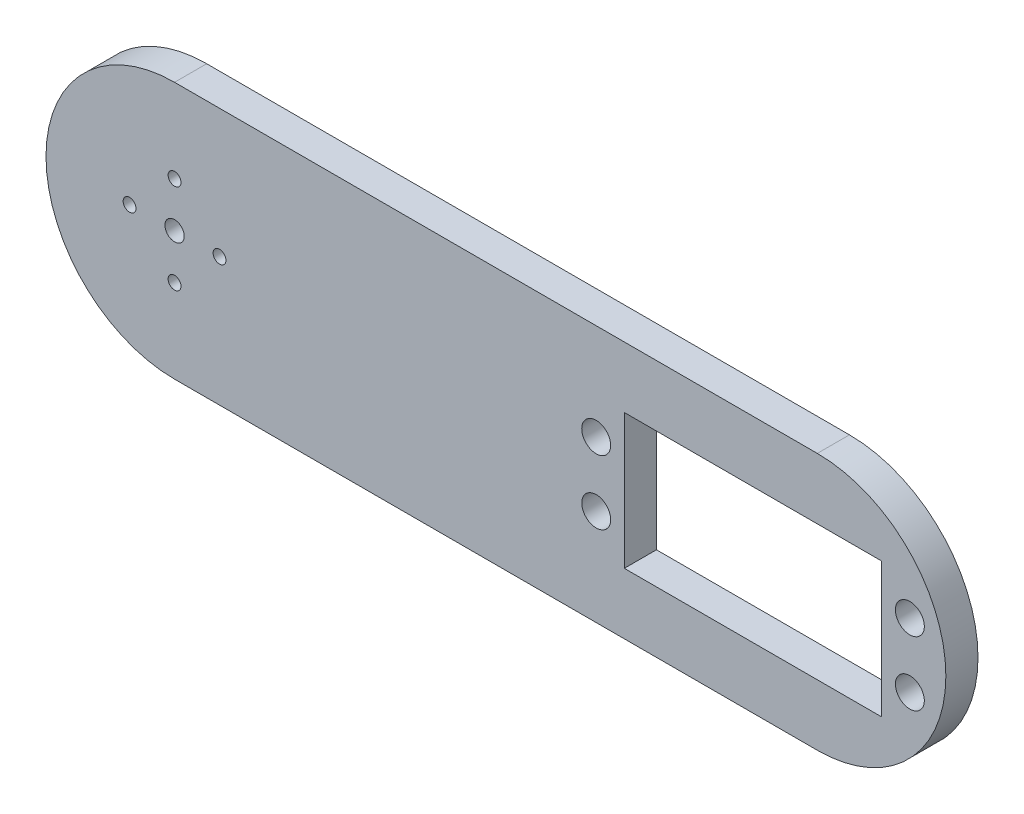
ISO-10303-21;
HEADER;
FILE_DESCRIPTION(('STEP AP214'),'2;1');
FILE_NAME('part.step','',(''),(''),'','','');
FILE_SCHEMA(('AUTOMOTIVE_DESIGN { 1 0 10303 214 1 1 1 1 }'));
ENDSEC;
DATA;
#1=APPLICATION_CONTEXT('core data for automotive mechanical design processes');
#2=APPLICATION_PROTOCOL_DEFINITION('international standard','automotive_design',2000,#1);
#3=PRODUCT_CONTEXT('',#1,'mechanical');
#4=PRODUCT('Part','Part','',(#3));
#5=PRODUCT_RELATED_PRODUCT_CATEGORY('part','',(#4));
#6=PRODUCT_DEFINITION_FORMATION('','',#4);
#7=PRODUCT_DEFINITION_CONTEXT('part definition',#1,'design');
#8=PRODUCT_DEFINITION('design','',#6,#7);
#9=PRODUCT_DEFINITION_SHAPE('','',#8);
#10=(LENGTH_UNIT() NAMED_UNIT(*) SI_UNIT(.MILLI.,.METRE.));
#11=(NAMED_UNIT(*) PLANE_ANGLE_UNIT() SI_UNIT($,.RADIAN.));
#12=(NAMED_UNIT(*) SI_UNIT($,.STERADIAN.) SOLID_ANGLE_UNIT());
#13=UNCERTAINTY_MEASURE_WITH_UNIT(LENGTH_MEASURE(1.E-05),#10,'distance_accuracy_value','');
#14=(GEOMETRIC_REPRESENTATION_CONTEXT(3) GLOBAL_UNCERTAINTY_ASSIGNED_CONTEXT((#13)) GLOBAL_UNIT_ASSIGNED_CONTEXT((#10,
#11,#12)) REPRESENTATION_CONTEXT('',''));
#15=CARTESIAN_POINT('',(0.,0.,0.));
#16=DIRECTION('',(0.,0.,1.));
#17=DIRECTION('',(1.,0.,0.));
#18=AXIS2_PLACEMENT_3D('',#15,#16,#17);
#19=CARTESIAN_POINT('',(0.,0.,0.));
#20=DIRECTION('',(0.,0.,-1.));
#21=DIRECTION('',(0.,1.,0.));
#22=AXIS2_PLACEMENT_3D('',#19,#20,#21);
#23=CYLINDRICAL_SURFACE('',#22,20.);
#24=CARTESIAN_POINT('',(0.,0.,-5.));
#25=DIRECTION('',(0.,0.,1.));
#26=DIRECTION('',(0.,-1.,0.));
#27=AXIS2_PLACEMENT_3D('',#24,#25,#26);
#28=CIRCLE('',#27,20.);
#29=CARTESIAN_POINT('',(0.,20.,-4.99999999999993));
#30=VERTEX_POINT('',#29);
#31=CARTESIAN_POINT('',(0.,-20.,-5.00000000000007));
#32=VERTEX_POINT('',#31);
#33=EDGE_CURVE('E166',#30,#32,#28,.T.);
#34=ORIENTED_EDGE('',*,*,#33,.T.);
#35=DIRECTION('',(0.,0.,-1.));
#36=VECTOR('',#35,1.);
#37=CARTESIAN_POINT('',(0.,-20.,0.));
#38=LINE('',#37,#36);
#39=CARTESIAN_POINT('',(0.,-20.,0.));
#40=VERTEX_POINT('',#39);
#41=EDGE_CURVE('E11',#40,#32,#38,.T.);
#42=ORIENTED_EDGE('',*,*,#41,.F.);
#43=CARTESIAN_POINT('',(0.,0.,0.));
#44=DIRECTION('',(0.,0.,1.));
#45=DIRECTION('',(0.,-1.,0.));
#46=AXIS2_PLACEMENT_3D('',#43,#44,#45);
#47=CIRCLE('',#46,20.);
#48=CARTESIAN_POINT('',(0.,20.,0.));
#49=VERTEX_POINT('',#48);
#50=EDGE_CURVE('E189',#49,#40,#47,.T.);
#51=ORIENTED_EDGE('',*,*,#50,.F.);
#52=DIRECTION('',(0.,0.,-1.));
#53=VECTOR('',#52,1.);
#54=CARTESIAN_POINT('',(0.,20.,0.));
#55=LINE('',#54,#53);
#56=EDGE_CURVE('E200',#49,#30,#55,.T.);
#57=ORIENTED_EDGE('',*,*,#56,.T.);
#58=EDGE_LOOP('',(#34,#42,#51,#57));
#59=FACE_BOUND('',#58,.T.);
#60=ADVANCED_FACE('F37',(#59),#23,.T.);
#61=CARTESIAN_POINT('',(100.,-20.0000000000001,0.));
#62=DIRECTION('',(0.,-1.,0.));
#63=DIRECTION('',(1.,0.,0.));
#64=AXIS2_PLACEMENT_3D('',#61,#62,#63);
#65=PLANE('',#64);
#66=DIRECTION('',(-1.,0.,0.));
#67=VECTOR('',#66,1.);
#68=CARTESIAN_POINT('',(100.,-20.0000000000001,-5.00000000000007));
#69=LINE('',#68,#67);
#70=CARTESIAN_POINT('',(100.,-20.,-5.00000000000007));
#71=VERTEX_POINT('',#70);
#72=EDGE_CURVE('E203',#71,#32,#69,.T.);
#73=ORIENTED_EDGE('',*,*,#72,.F.);
#74=DIRECTION('',(0.,0.,-1.));
#75=VECTOR('',#74,1.);
#76=CARTESIAN_POINT('',(100.,-20.0000000000001,0.));
#77=LINE('',#76,#75);
#78=CARTESIAN_POINT('',(100.,-20.0000000000001,0.));
#79=VERTEX_POINT('',#78);
#80=EDGE_CURVE('E44',#79,#71,#77,.T.);
#81=ORIENTED_EDGE('',*,*,#80,.F.);
#82=DIRECTION('',(-1.,0.,0.));
#83=VECTOR('',#82,1.);
#84=CARTESIAN_POINT('',(100.,-20.0000000000001,0.));
#85=LINE('',#84,#83);
#86=EDGE_CURVE('E191',#79,#40,#85,.T.);
#87=ORIENTED_EDGE('',*,*,#86,.T.);
#88=ORIENTED_EDGE('',*,*,#41,.T.);
#89=EDGE_LOOP('',(#73,#81,#87,#88));
#90=FACE_BOUND('',#89,.T.);
#91=ADVANCED_FACE('F224',(#90),#65,.T.);
#92=CARTESIAN_POINT('',(100.,0.,0.));
#93=DIRECTION('',(0.,0.,-1.));
#94=DIRECTION('',(0.,1.,0.));
#95=AXIS2_PLACEMENT_3D('',#92,#93,#94);
#96=CYLINDRICAL_SURFACE('',#95,20.);
#97=CARTESIAN_POINT('',(100.,0.,-5.));
#98=DIRECTION('',(0.,0.,1.));
#99=DIRECTION('',(0.,-1.,0.));
#100=AXIS2_PLACEMENT_3D('',#97,#98,#99);
#101=CIRCLE('',#100,20.);
#102=CARTESIAN_POINT('',(100.,20.,-4.99999999999993));
#103=VERTEX_POINT('',#102);
#104=EDGE_CURVE('E206',#71,#103,#101,.T.);
#105=ORIENTED_EDGE('',*,*,#104,.T.);
#106=DIRECTION('',(0.,0.,-1.));
#107=VECTOR('',#106,1.);
#108=CARTESIAN_POINT('',(100.,20.,0.));
#109=LINE('',#108,#107);
#110=CARTESIAN_POINT('',(100.,20.,0.));
#111=VERTEX_POINT('',#110);
#112=EDGE_CURVE('E212',#111,#103,#109,.T.);
#113=ORIENTED_EDGE('',*,*,#112,.F.);
#114=CARTESIAN_POINT('',(100.,0.,0.));
#115=DIRECTION('',(0.,0.,1.));
#116=DIRECTION('',(0.,-1.,0.));
#117=AXIS2_PLACEMENT_3D('',#114,#115,#116);
#118=CIRCLE('',#117,20.);
#119=EDGE_CURVE('E195',#79,#111,#118,.T.);
#120=ORIENTED_EDGE('',*,*,#119,.F.);
#121=ORIENTED_EDGE('',*,*,#80,.T.);
#122=EDGE_LOOP('',(#105,#113,#120,#121));
#123=FACE_BOUND('',#122,.T.);
#124=ADVANCED_FACE('F216',(#123),#96,.T.);
#125=CARTESIAN_POINT('',(0.,20.,0.));
#126=DIRECTION('',(0.,1.,0.));
#127=DIRECTION('',(-1.,0.,0.));
#128=AXIS2_PLACEMENT_3D('',#125,#126,#127);
#129=PLANE('',#128);
#130=DIRECTION('',(1.,0.,0.));
#131=VECTOR('',#130,1.);
#132=CARTESIAN_POINT('',(0.,20.,-4.99999999999993));
#133=LINE('',#132,#131);
#134=EDGE_CURVE('E192',#30,#103,#133,.T.);
#135=ORIENTED_EDGE('',*,*,#134,.F.);
#136=ORIENTED_EDGE('',*,*,#56,.F.);
#137=DIRECTION('',(1.,0.,0.));
#138=VECTOR('',#137,1.);
#139=CARTESIAN_POINT('',(0.,20.,0.));
#140=LINE('',#139,#138);
#141=EDGE_CURVE('E197',#49,#111,#140,.T.);
#142=ORIENTED_EDGE('',*,*,#141,.T.);
#143=ORIENTED_EDGE('',*,*,#112,.T.);
#144=EDGE_LOOP('',(#135,#136,#142,#143));
#145=FACE_BOUND('',#144,.T.);
#146=ADVANCED_FACE('F229',(#145),#129,.T.);
#147=CARTESIAN_POINT('',(0.,0.,0.));
#148=DIRECTION('',(0.,0.,1.));
#149=DIRECTION('',(0.,-1.,0.));
#150=AXIS2_PLACEMENT_3D('',#147,#148,#149);
#151=PLANE('',#150);
#152=CARTESIAN_POINT('',(114.4,4.99999999999997,0.));
#153=DIRECTION('',(0.,0.,1.));
#154=DIRECTION('',(-1.,0.,0.));
#155=AXIS2_PLACEMENT_3D('',#152,#153,#154);
#156=CIRCLE('',#155,2.25);
#157=CARTESIAN_POINT('',(112.15,4.99999999999997,0.));
#158=VERTEX_POINT('',#157);
#159=EDGE_CURVE('E143',#158,#158,#156,.T.);
#160=ORIENTED_EDGE('',*,*,#159,.F.);
#161=EDGE_LOOP('',(#160));
#162=FACE_BOUND('',#161,.T.);
#163=CARTESIAN_POINT('',(65.6,-5.00000000000037,0.));
#164=DIRECTION('',(0.,0.,1.));
#165=DIRECTION('',(1.,0.,0.));
#166=AXIS2_PLACEMENT_3D('',#163,#164,#165);
#167=CIRCLE('',#166,2.25);
#168=CARTESIAN_POINT('',(67.85,-5.00000000000037,0.));
#169=VERTEX_POINT('',#168);
#170=EDGE_CURVE('E149',#169,#169,#167,.T.);
#171=ORIENTED_EDGE('',*,*,#170,.F.);
#172=EDGE_LOOP('',(#171));
#173=FACE_BOUND('',#172,.T.);
#174=CARTESIAN_POINT('',(65.6,4.99999999999963,0.));
#175=DIRECTION('',(0.,0.,1.));
#176=DIRECTION('',(-1.,0.,0.));
#177=AXIS2_PLACEMENT_3D('',#174,#175,#176);
#178=CIRCLE('',#177,2.25);
#179=CARTESIAN_POINT('',(63.35,4.99999999999963,0.));
#180=VERTEX_POINT('',#179);
#181=EDGE_CURVE('E124',#180,#180,#178,.T.);
#182=ORIENTED_EDGE('',*,*,#181,.F.);
#183=EDGE_LOOP('',(#182));
#184=FACE_BOUND('',#183,.T.);
#185=DIRECTION('',(0.,1.,0.));
#186=VECTOR('',#185,1.);
#187=CARTESIAN_POINT('',(110.025,-10.5,0.));
#188=LINE('',#187,#186);
#189=CARTESIAN_POINT('',(110.025,-10.5,0.));
#190=VERTEX_POINT('',#189);
#191=CARTESIAN_POINT('',(110.025,10.5,0.));
#192=VERTEX_POINT('',#191);
#193=EDGE_CURVE('E51',#190,#192,#188,.T.);
#194=ORIENTED_EDGE('',*,*,#193,.F.);
#195=DIRECTION('',(1.,0.,0.));
#196=VECTOR('',#195,1.);
#197=CARTESIAN_POINT('',(69.975,-10.5,0.));
#198=LINE('',#197,#196);
#199=CARTESIAN_POINT('',(69.975,-10.5,0.));
#200=VERTEX_POINT('',#199);
#201=EDGE_CURVE('E118',#200,#190,#198,.T.);
#202=ORIENTED_EDGE('',*,*,#201,.F.);
#203=DIRECTION('',(0.,-1.,0.));
#204=VECTOR('',#203,1.);
#205=CARTESIAN_POINT('',(69.975,-10.5,0.));
#206=LINE('',#205,#204);
#207=CARTESIAN_POINT('',(69.975,10.5,0.));
#208=VERTEX_POINT('',#207);
#209=EDGE_CURVE('E121',#208,#200,#206,.T.);
#210=ORIENTED_EDGE('',*,*,#209,.F.);
#211=DIRECTION('',(-1.,0.,0.));
#212=VECTOR('',#211,1.);
#213=CARTESIAN_POINT('',(69.975,10.5,0.));
#214=LINE('',#213,#212);
#215=EDGE_CURVE('E130',#192,#208,#214,.T.);
#216=ORIENTED_EDGE('',*,*,#215,.F.);
#217=EDGE_LOOP('',(#194,#202,#210,#216));
#218=FACE_BOUND('',#217,.T.);
#219=CARTESIAN_POINT('',(114.4,-5.00000000000003,0.));
#220=DIRECTION('',(0.,0.,1.));
#221=DIRECTION('',(1.,0.,0.));
#222=AXIS2_PLACEMENT_3D('',#219,#220,#221);
#223=CIRCLE('',#222,2.25);
#224=CARTESIAN_POINT('',(116.65,-5.00000000000003,0.));
#225=VERTEX_POINT('',#224);
#226=EDGE_CURVE('E142',#225,#225,#223,.T.);
#227=ORIENTED_EDGE('',*,*,#226,.F.);
#228=EDGE_LOOP('',(#227));
#229=FACE_BOUND('',#228,.T.);
#230=CARTESIAN_POINT('',(0.,6.99999999999998,0.));
#231=DIRECTION('',(0.,0.,1.));
#232=DIRECTION('',(0.,-1.,0.));
#233=AXIS2_PLACEMENT_3D('',#230,#231,#232);
#234=CIRCLE('',#233,1.);
#235=CARTESIAN_POINT('',(0.,5.99999999999998,0.));
#236=VERTEX_POINT('',#235);
#237=EDGE_CURVE('E159',#236,#236,#234,.T.);
#238=ORIENTED_EDGE('',*,*,#237,.F.);
#239=EDGE_LOOP('',(#238));
#240=FACE_BOUND('',#239,.T.);
#241=CARTESIAN_POINT('',(-6.999,-0.00100000000001874,0.));
#242=DIRECTION('',(0.,0.,1.));
#243=DIRECTION('',(0.,-1.,0.));
#244=AXIS2_PLACEMENT_3D('',#241,#242,#243);
#245=CIRCLE('',#244,1.);
#246=CARTESIAN_POINT('',(-6.999,-1.00100000000002,0.));
#247=VERTEX_POINT('',#246);
#248=EDGE_CURVE('E171',#247,#247,#245,.T.);
#249=ORIENTED_EDGE('',*,*,#248,.F.);
#250=EDGE_LOOP('',(#249));
#251=FACE_BOUND('',#250,.T.);
#252=CARTESIAN_POINT('',(0.00200000000000086,-7.00000000000002,0.));
#253=DIRECTION('',(0.,0.,1.));
#254=DIRECTION('',(0.,-1.,0.));
#255=AXIS2_PLACEMENT_3D('',#252,#253,#254);
#256=CIRCLE('',#255,1.);
#257=CARTESIAN_POINT('',(0.00200000000000086,-8.00000000000002,0.));
#258=VERTEX_POINT('',#257);
#259=EDGE_CURVE('E170',#258,#258,#256,.T.);
#260=ORIENTED_EDGE('',*,*,#259,.F.);
#261=EDGE_LOOP('',(#260));
#262=FACE_BOUND('',#261,.T.);
#263=CARTESIAN_POINT('',(7.001,0.000999999999982971,0.));
#264=DIRECTION('',(0.,0.,1.));
#265=DIRECTION('',(0.,-1.,0.));
#266=AXIS2_PLACEMENT_3D('',#263,#264,#265);
#267=CIRCLE('',#266,1.);
#268=CARTESIAN_POINT('',(7.001,-0.999000000000019,0.));
#269=VERTEX_POINT('',#268);
#270=EDGE_CURVE('E182',#269,#269,#267,.T.);
#271=ORIENTED_EDGE('',*,*,#270,.F.);
#272=EDGE_LOOP('',(#271));
#273=FACE_BOUND('',#272,.T.);
#274=CARTESIAN_POINT('',(0.,0.,0.));
#275=DIRECTION('',(0.,0.,1.));
#276=DIRECTION('',(0.,-1.,0.));
#277=AXIS2_PLACEMENT_3D('',#274,#275,#276);
#278=CIRCLE('',#277,1.5);
#279=CARTESIAN_POINT('',(0.,-1.50000000000002,0.));
#280=VERTEX_POINT('',#279);
#281=EDGE_CURVE('E163',#280,#280,#278,.T.);
#282=ORIENTED_EDGE('',*,*,#281,.F.);
#283=EDGE_LOOP('',(#282));
#284=FACE_BOUND('',#283,.T.);
#285=ORIENTED_EDGE('',*,*,#50,.T.);
#286=ORIENTED_EDGE('',*,*,#86,.F.);
#287=ORIENTED_EDGE('',*,*,#119,.T.);
#288=ORIENTED_EDGE('',*,*,#141,.F.);
#289=EDGE_LOOP('',(#285,#286,#287,#288));
#290=FACE_BOUND('',#289,.T.);
#291=ADVANCED_FACE('F232',(#162,#173,#184,#218,#229,#240,#251,#262,#273,#284,#290),#151,.T.);
#292=CARTESIAN_POINT('',(0.,0.,-5.));
#293=DIRECTION('',(0.,0.,1.));
#294=DIRECTION('',(0.,-1.,0.));
#295=AXIS2_PLACEMENT_3D('',#292,#293,#294);
#296=PLANE('',#295);
#297=CARTESIAN_POINT('',(114.4,4.99999999999997,-5.00000000000007));
#298=DIRECTION('',(0.,0.,1.));
#299=DIRECTION('',(-1.,0.,0.));
#300=AXIS2_PLACEMENT_3D('',#297,#298,#299);
#301=CIRCLE('',#300,2.25);
#302=CARTESIAN_POINT('',(112.15,4.99999999999997,-5.00000000000007));
#303=VERTEX_POINT('',#302);
#304=EDGE_CURVE('E139',#303,#303,#301,.T.);
#305=ORIENTED_EDGE('',*,*,#304,.T.);
#306=EDGE_LOOP('',(#305));
#307=FACE_BOUND('',#306,.T.);
#308=CARTESIAN_POINT('',(65.6,-5.00000000000037,-5.00000000000007));
#309=DIRECTION('',(0.,0.,1.));
#310=DIRECTION('',(1.,0.,0.));
#311=AXIS2_PLACEMENT_3D('',#308,#309,#310);
#312=CIRCLE('',#311,2.25);
#313=CARTESIAN_POINT('',(67.85,-5.00000000000037,-5.00000000000007));
#314=VERTEX_POINT('',#313);
#315=EDGE_CURVE('E146',#314,#314,#312,.T.);
#316=ORIENTED_EDGE('',*,*,#315,.T.);
#317=EDGE_LOOP('',(#316));
#318=FACE_BOUND('',#317,.T.);
#319=CARTESIAN_POINT('',(65.6,4.99999999999963,-5.00000000000007));
#320=DIRECTION('',(0.,0.,1.));
#321=DIRECTION('',(-1.,0.,0.));
#322=AXIS2_PLACEMENT_3D('',#319,#320,#321);
#323=CIRCLE('',#322,2.25);
#324=CARTESIAN_POINT('',(63.35,4.99999999999963,-5.00000000000007));
#325=VERTEX_POINT('',#324);
#326=EDGE_CURVE('E152',#325,#325,#323,.T.);
#327=ORIENTED_EDGE('',*,*,#326,.T.);
#328=EDGE_LOOP('',(#327));
#329=FACE_BOUND('',#328,.T.);
#330=DIRECTION('',(1.,0.,0.));
#331=VECTOR('',#330,1.);
#332=CARTESIAN_POINT('',(69.975,-10.5,-5.00000000000007));
#333=LINE('',#332,#331);
#334=CARTESIAN_POINT('',(69.975,-10.5,-5.00000000000007));
#335=VERTEX_POINT('',#334);
#336=CARTESIAN_POINT('',(110.025,-10.5,-5.00000000000007));
#337=VERTEX_POINT('',#336);
#338=EDGE_CURVE('E108',#335,#337,#333,.T.);
#339=ORIENTED_EDGE('',*,*,#338,.T.);
#340=DIRECTION('',(0.,1.,0.));
#341=VECTOR('',#340,1.);
#342=CARTESIAN_POINT('',(110.025,-10.5,-5.00000000000007));
#343=LINE('',#342,#341);
#344=CARTESIAN_POINT('',(110.025,10.5,-5.00000000000007));
#345=VERTEX_POINT('',#344);
#346=EDGE_CURVE('E102',#337,#345,#343,.T.);
#347=ORIENTED_EDGE('',*,*,#346,.T.);
#348=DIRECTION('',(-1.,0.,0.));
#349=VECTOR('',#348,1.);
#350=CARTESIAN_POINT('',(69.975,10.5,-5.00000000000007));
#351=LINE('',#350,#349);
#352=CARTESIAN_POINT('',(69.975,10.5,-4.99999999999996));
#353=VERTEX_POINT('',#352);
#354=EDGE_CURVE('E111',#345,#353,#351,.T.);
#355=ORIENTED_EDGE('',*,*,#354,.T.);
#356=DIRECTION('',(0.,-1.,0.));
#357=VECTOR('',#356,1.);
#358=CARTESIAN_POINT('',(69.975,-10.5,-5.00000000000007));
#359=LINE('',#358,#357);
#360=EDGE_CURVE('E59',#353,#335,#359,.T.);
#361=ORIENTED_EDGE('',*,*,#360,.T.);
#362=EDGE_LOOP('',(#339,#347,#355,#361));
#363=FACE_BOUND('',#362,.T.);
#364=CARTESIAN_POINT('',(114.4,-5.00000000000003,-5.00000000000007));
#365=DIRECTION('',(0.,0.,1.));
#366=DIRECTION('',(1.,0.,0.));
#367=AXIS2_PLACEMENT_3D('',#364,#365,#366);
#368=CIRCLE('',#367,2.25);
#369=CARTESIAN_POINT('',(116.65,-5.00000000000003,-5.00000000000007));
#370=VERTEX_POINT('',#369);
#371=EDGE_CURVE('E153',#370,#370,#368,.T.);
#372=ORIENTED_EDGE('',*,*,#371,.T.);
#373=EDGE_LOOP('',(#372));
#374=FACE_BOUND('',#373,.T.);
#375=CARTESIAN_POINT('',(0.,7.,-4.99999999999998));
#376=DIRECTION('',(0.,0.,1.));
#377=DIRECTION('',(0.,-1.,0.));
#378=AXIS2_PLACEMENT_3D('',#375,#376,#377);
#379=CIRCLE('',#378,1.);
#380=CARTESIAN_POINT('',(0.,6.,-4.99999999999998));
#381=VERTEX_POINT('',#380);
#382=EDGE_CURVE('E162',#381,#381,#379,.F.);
#383=ORIENTED_EDGE('',*,*,#382,.F.);
#384=EDGE_LOOP('',(#383));
#385=FACE_BOUND('',#384,.T.);
#386=CARTESIAN_POINT('',(-6.999,-0.00100000000000129,-5.));
#387=DIRECTION('',(0.,0.,1.));
#388=DIRECTION('',(0.,-1.,0.));
#389=AXIS2_PLACEMENT_3D('',#386,#387,#388);
#390=CIRCLE('',#389,1.);
#391=CARTESIAN_POINT('',(-6.999,-1.001,-5.));
#392=VERTEX_POINT('',#391);
#393=EDGE_CURVE('E156',#392,#392,#390,.F.);
#394=ORIENTED_EDGE('',*,*,#393,.F.);
#395=EDGE_LOOP('',(#394));
#396=FACE_BOUND('',#395,.T.);
#397=CARTESIAN_POINT('',(0.00200000000000086,-7.,-5.00000000000002));
#398=DIRECTION('',(0.,0.,1.));
#399=DIRECTION('',(0.,-1.,0.));
#400=AXIS2_PLACEMENT_3D('',#397,#398,#399);
#401=CIRCLE('',#400,1.);
#402=CARTESIAN_POINT('',(0.00200000000000086,-8.,-5.00000000000003));
#403=VERTEX_POINT('',#402);
#404=EDGE_CURVE('E167',#403,#403,#401,.F.);
#405=ORIENTED_EDGE('',*,*,#404,.F.);
#406=EDGE_LOOP('',(#405));
#407=FACE_BOUND('',#406,.T.);
#408=CARTESIAN_POINT('',(7.001,0.00100000000000043,-5.));
#409=DIRECTION('',(0.,0.,1.));
#410=DIRECTION('',(0.,-1.,0.));
#411=AXIS2_PLACEMENT_3D('',#408,#409,#410);
#412=CIRCLE('',#411,1.);
#413=CARTESIAN_POINT('',(7.001,-0.999000000000001,-5.));
#414=VERTEX_POINT('',#413);
#415=EDGE_CURVE('E174',#414,#414,#412,.F.);
#416=ORIENTED_EDGE('',*,*,#415,.F.);
#417=EDGE_LOOP('',(#416));
#418=FACE_BOUND('',#417,.T.);
#419=CARTESIAN_POINT('',(0.,0.,-5.));
#420=DIRECTION('',(0.,0.,1.));
#421=DIRECTION('',(0.,-1.,0.));
#422=AXIS2_PLACEMENT_3D('',#419,#420,#421);
#423=CIRCLE('',#422,1.5);
#424=CARTESIAN_POINT('',(0.,-1.5,-5.00000000000001));
#425=VERTEX_POINT('',#424);
#426=EDGE_CURVE('E179',#425,#425,#423,.F.);
#427=ORIENTED_EDGE('',*,*,#426,.F.);
#428=EDGE_LOOP('',(#427));
#429=FACE_BOUND('',#428,.T.);
#430=ORIENTED_EDGE('',*,*,#33,.F.);
#431=ORIENTED_EDGE('',*,*,#134,.T.);
#432=ORIENTED_EDGE('',*,*,#104,.F.);
#433=ORIENTED_EDGE('',*,*,#72,.T.);
#434=EDGE_LOOP('',(#430,#431,#432,#433));
#435=FACE_BOUND('',#434,.T.);
#436=ADVANCED_FACE('F115',(#307,#318,#329,#363,#374,#385,#396,#407,#418,#429,#435),#296,.F.);
#437=CARTESIAN_POINT('',(0.,0.,-5.001));
#438=DIRECTION('',(0.,0.,1.));
#439=DIRECTION('',(0.,-1.,0.));
#440=AXIS2_PLACEMENT_3D('',#437,#438,#439);
#441=CYLINDRICAL_SURFACE('',#440,1.5);
#442=ORIENTED_EDGE('',*,*,#281,.T.);
#443=EDGE_LOOP('',(#442));
#444=FACE_BOUND('',#443,.T.);
#445=ORIENTED_EDGE('',*,*,#426,.T.);
#446=EDGE_LOOP('',(#445));
#447=FACE_BOUND('',#446,.T.);
#448=ADVANCED_FACE('F240',(#444,#447),#441,.F.);
#449=CARTESIAN_POINT('',(7.001,0.00100000000000043,-5.001));
#450=DIRECTION('',(0.,0.,1.));
#451=DIRECTION('',(0.,-1.,0.));
#452=AXIS2_PLACEMENT_3D('',#449,#450,#451);
#453=CYLINDRICAL_SURFACE('',#452,1.);
#454=ORIENTED_EDGE('',*,*,#270,.T.);
#455=EDGE_LOOP('',(#454));
#456=FACE_BOUND('',#455,.T.);
#457=ORIENTED_EDGE('',*,*,#415,.T.);
#458=EDGE_LOOP('',(#457));
#459=FACE_BOUND('',#458,.T.);
#460=ADVANCED_FACE('F283',(#456,#459),#453,.F.);
#461=CARTESIAN_POINT('',(0.00200000000000086,-7.,-5.00100000000002));
#462=DIRECTION('',(0.,0.,1.));
#463=DIRECTION('',(0.,-1.,0.));
#464=AXIS2_PLACEMENT_3D('',#461,#462,#463);
#465=CYLINDRICAL_SURFACE('',#464,1.);
#466=ORIENTED_EDGE('',*,*,#259,.T.);
#467=EDGE_LOOP('',(#466));
#468=FACE_BOUND('',#467,.T.);
#469=ORIENTED_EDGE('',*,*,#404,.T.);
#470=EDGE_LOOP('',(#469));
#471=FACE_BOUND('',#470,.T.);
#472=ADVANCED_FACE('F293',(#468,#471),#465,.F.);
#473=CARTESIAN_POINT('',(-6.999,-0.00100000000000128,-5.001));
#474=DIRECTION('',(0.,0.,1.));
#475=DIRECTION('',(0.,-1.,0.));
#476=AXIS2_PLACEMENT_3D('',#473,#474,#475);
#477=CYLINDRICAL_SURFACE('',#476,1.);
#478=ORIENTED_EDGE('',*,*,#248,.T.);
#479=EDGE_LOOP('',(#478));
#480=FACE_BOUND('',#479,.T.);
#481=ORIENTED_EDGE('',*,*,#393,.T.);
#482=EDGE_LOOP('',(#481));
#483=FACE_BOUND('',#482,.T.);
#484=ADVANCED_FACE('F302',(#480,#483),#477,.F.);
#485=CARTESIAN_POINT('',(0.,7.,-5.00099999999998));
#486=DIRECTION('',(0.,0.,1.));
#487=DIRECTION('',(0.,-1.,0.));
#488=AXIS2_PLACEMENT_3D('',#485,#486,#487);
#489=CYLINDRICAL_SURFACE('',#488,1.);
#490=ORIENTED_EDGE('',*,*,#237,.T.);
#491=EDGE_LOOP('',(#490));
#492=FACE_BOUND('',#491,.T.);
#493=ORIENTED_EDGE('',*,*,#382,.T.);
#494=EDGE_LOOP('',(#493));
#495=FACE_BOUND('',#494,.T.);
#496=ADVANCED_FACE('F312',(#492,#495),#489,.F.);
#497=CARTESIAN_POINT('',(114.4,-5.00000000000003,-5.00000000000007));
#498=DIRECTION('',(0.,0.,1.));
#499=DIRECTION('',(1.,0.,0.));
#500=AXIS2_PLACEMENT_3D('',#497,#498,#499);
#501=CYLINDRICAL_SURFACE('',#500,2.25);
#502=ORIENTED_EDGE('',*,*,#371,.F.);
#503=EDGE_LOOP('',(#502));
#504=FACE_BOUND('',#503,.T.);
#505=ORIENTED_EDGE('',*,*,#226,.T.);
#506=EDGE_LOOP('',(#505));
#507=FACE_BOUND('',#506,.T.);
#508=ADVANCED_FACE('F322',(#504,#507),#501,.F.);
#509=CARTESIAN_POINT('',(110.025,-10.5,-5.00000000000007));
#510=DIRECTION('',(1.,0.,0.));
#511=DIRECTION('',(0.,0.,-1.));
#512=AXIS2_PLACEMENT_3D('',#509,#510,#511);
#513=PLANE('',#512);
#514=ORIENTED_EDGE('',*,*,#193,.T.);
#515=DIRECTION('',(0.,0.,1.));
#516=VECTOR('',#515,1.);
#517=CARTESIAN_POINT('',(110.025,10.5,-5.00000000000007));
#518=LINE('',#517,#516);
#519=EDGE_CURVE('E98',#345,#192,#518,.T.);
#520=ORIENTED_EDGE('',*,*,#519,.F.);
#521=ORIENTED_EDGE('',*,*,#346,.F.);
#522=DIRECTION('',(0.,0.,1.));
#523=VECTOR('',#522,1.);
#524=CARTESIAN_POINT('',(110.025,-10.5,-5.00000000000007));
#525=LINE('',#524,#523);
#526=EDGE_CURVE('E134',#337,#190,#525,.T.);
#527=ORIENTED_EDGE('',*,*,#526,.T.);
#528=EDGE_LOOP('',(#514,#520,#521,#527));
#529=FACE_BOUND('',#528,.T.);
#530=ADVANCED_FACE('F100',(#529),#513,.F.);
#531=CARTESIAN_POINT('',(69.975,-10.5,-5.00000000000007));
#532=DIRECTION('',(0.,-1.,0.));
#533=DIRECTION('',(0.,0.,-1.));
#534=AXIS2_PLACEMENT_3D('',#531,#532,#533);
#535=PLANE('',#534);
#536=ORIENTED_EDGE('',*,*,#201,.T.);
#537=ORIENTED_EDGE('',*,*,#526,.F.);
#538=ORIENTED_EDGE('',*,*,#338,.F.);
#539=DIRECTION('',(0.,0.,1.));
#540=VECTOR('',#539,1.);
#541=CARTESIAN_POINT('',(69.975,-10.5,-5.00000000000007));
#542=LINE('',#541,#540);
#543=EDGE_CURVE('E136',#335,#200,#542,.T.);
#544=ORIENTED_EDGE('',*,*,#543,.T.);
#545=EDGE_LOOP('',(#536,#537,#538,#544));
#546=FACE_BOUND('',#545,.T.);
#547=ADVANCED_FACE('F341',(#546),#535,.F.);
#548=CARTESIAN_POINT('',(69.975,-10.5,-5.00000000000007));
#549=DIRECTION('',(-1.,0.,0.));
#550=DIRECTION('',(0.,0.,1.));
#551=AXIS2_PLACEMENT_3D('',#548,#549,#550);
#552=PLANE('',#551);
#553=ORIENTED_EDGE('',*,*,#209,.T.);
#554=ORIENTED_EDGE('',*,*,#543,.F.);
#555=ORIENTED_EDGE('',*,*,#360,.F.);
#556=DIRECTION('',(0.,0.,1.));
#557=VECTOR('',#556,1.);
#558=CARTESIAN_POINT('',(69.975,10.5,-5.00000000000007));
#559=LINE('',#558,#557);
#560=EDGE_CURVE('E107',#353,#208,#559,.T.);
#561=ORIENTED_EDGE('',*,*,#560,.T.);
#562=EDGE_LOOP('',(#553,#554,#555,#561));
#563=FACE_BOUND('',#562,.T.);
#564=ADVANCED_FACE('F350',(#563),#552,.F.);
#565=CARTESIAN_POINT('',(69.975,10.5,-5.00000000000007));
#566=DIRECTION('',(0.,1.,0.));
#567=DIRECTION('',(0.,0.,1.));
#568=AXIS2_PLACEMENT_3D('',#565,#566,#567);
#569=PLANE('',#568);
#570=ORIENTED_EDGE('',*,*,#215,.T.);
#571=ORIENTED_EDGE('',*,*,#560,.F.);
#572=ORIENTED_EDGE('',*,*,#354,.F.);
#573=ORIENTED_EDGE('',*,*,#519,.T.);
#574=EDGE_LOOP('',(#570,#571,#572,#573));
#575=FACE_BOUND('',#574,.T.);
#576=ADVANCED_FACE('F112',(#575),#569,.F.);
#577=CARTESIAN_POINT('',(65.6,4.99999999999963,-5.00000000000007));
#578=DIRECTION('',(0.,0.,1.));
#579=DIRECTION('',(1.,0.,0.));
#580=AXIS2_PLACEMENT_3D('',#577,#578,#579);
#581=CYLINDRICAL_SURFACE('',#580,2.25);
#582=ORIENTED_EDGE('',*,*,#326,.F.);
#583=EDGE_LOOP('',(#582));
#584=FACE_BOUND('',#583,.T.);
#585=ORIENTED_EDGE('',*,*,#181,.T.);
#586=EDGE_LOOP('',(#585));
#587=FACE_BOUND('',#586,.T.);
#588=ADVANCED_FACE('F368',(#584,#587),#581,.F.);
#589=CARTESIAN_POINT('',(65.6,-5.00000000000037,-5.00000000000007));
#590=DIRECTION('',(0.,0.,1.));
#591=DIRECTION('',(1.,0.,0.));
#592=AXIS2_PLACEMENT_3D('',#589,#590,#591);
#593=CYLINDRICAL_SURFACE('',#592,2.25);
#594=ORIENTED_EDGE('',*,*,#315,.F.);
#595=EDGE_LOOP('',(#594));
#596=FACE_BOUND('',#595,.T.);
#597=ORIENTED_EDGE('',*,*,#170,.T.);
#598=EDGE_LOOP('',(#597));
#599=FACE_BOUND('',#598,.T.);
#600=ADVANCED_FACE('F377',(#596,#599),#593,.F.);
#601=CARTESIAN_POINT('',(114.4,4.99999999999997,-5.00000000000007));
#602=DIRECTION('',(0.,0.,1.));
#603=DIRECTION('',(1.,0.,0.));
#604=AXIS2_PLACEMENT_3D('',#601,#602,#603);
#605=CYLINDRICAL_SURFACE('',#604,2.25);
#606=ORIENTED_EDGE('',*,*,#304,.F.);
#607=EDGE_LOOP('',(#606));
#608=FACE_BOUND('',#607,.T.);
#609=ORIENTED_EDGE('',*,*,#159,.T.);
#610=EDGE_LOOP('',(#609));
#611=FACE_BOUND('',#610,.T.);
#612=ADVANCED_FACE('F387',(#608,#611),#605,.F.);
#613=CLOSED_SHELL('',(#60,#91,#124,#146,#291,#436,#448,#460,#472,#484,#496,#508,#530,#547,#564,
#576,#588,#600,#612));
#614=MANIFOLD_SOLID_BREP('B2',#613);
#615=ADVANCED_BREP_SHAPE_REPRESENTATION('',(#18,#614),#14);
#616=SHAPE_DEFINITION_REPRESENTATION(#9,#615);
ENDSEC;
END-ISO-10303-21;
